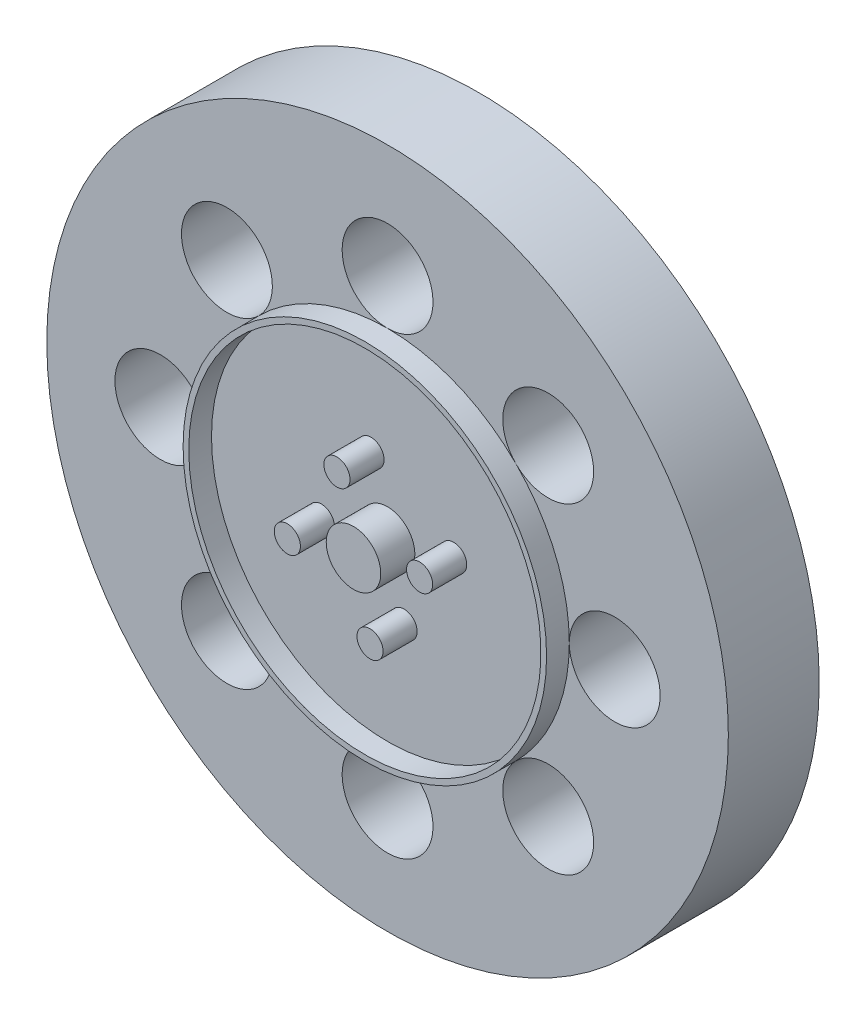
ISO-10303-21;
HEADER;
FILE_DESCRIPTION(('STEP AP214'),'2;1');
FILE_NAME('part.step','',(''),(''),'','','');
FILE_SCHEMA(('AUTOMOTIVE_DESIGN { 1 0 10303 214 1 1 1 1 }'));
ENDSEC;
DATA;
#1=APPLICATION_CONTEXT('core data for automotive mechanical design processes');
#2=APPLICATION_PROTOCOL_DEFINITION('international standard','automotive_design',2000,#1);
#3=PRODUCT_CONTEXT('',#1,'mechanical');
#4=PRODUCT('Part','Part','',(#3));
#5=PRODUCT_RELATED_PRODUCT_CATEGORY('part','',(#4));
#6=PRODUCT_DEFINITION_FORMATION('','',#4);
#7=PRODUCT_DEFINITION_CONTEXT('part definition',#1,'design');
#8=PRODUCT_DEFINITION('design','',#6,#7);
#9=PRODUCT_DEFINITION_SHAPE('','',#8);
#10=(LENGTH_UNIT() NAMED_UNIT(*) SI_UNIT(.MILLI.,.METRE.));
#11=(NAMED_UNIT(*) PLANE_ANGLE_UNIT() SI_UNIT($,.RADIAN.));
#12=(NAMED_UNIT(*) SI_UNIT($,.STERADIAN.) SOLID_ANGLE_UNIT());
#13=UNCERTAINTY_MEASURE_WITH_UNIT(LENGTH_MEASURE(1.E-05),#10,'distance_accuracy_value','');
#14=(GEOMETRIC_REPRESENTATION_CONTEXT(3) GLOBAL_UNCERTAINTY_ASSIGNED_CONTEXT((#13)) GLOBAL_UNIT_ASSIGNED_CONTEXT((#10,
#11,#12)) REPRESENTATION_CONTEXT('',''));
#15=CARTESIAN_POINT('',(0.,0.,0.));
#16=DIRECTION('',(0.,0.,1.));
#17=DIRECTION('',(1.,0.,0.));
#18=AXIS2_PLACEMENT_3D('',#15,#16,#17);
#19=CARTESIAN_POINT('',(0.,0.,-18.));
#20=DIRECTION('',(0.,0.,1.));
#21=DIRECTION('',(1.,0.,0.));
#22=AXIS2_PLACEMENT_3D('',#19,#20,#21);
#23=CYLINDRICAL_SURFACE('',#22,30.);
#24=CARTESIAN_POINT('',(0.,0.,-18.));
#25=DIRECTION('',(0.,0.,-1.));
#26=DIRECTION('',(-1.,0.,0.));
#27=AXIS2_PLACEMENT_3D('',#24,#25,#26);
#28=CIRCLE('',#27,30.);
#29=CARTESIAN_POINT('',(-30.,0.,-18.));
#30=VERTEX_POINT('',#29);
#31=EDGE_CURVE('E243',#30,#30,#28,.T.);
#32=ORIENTED_EDGE('',*,*,#31,.F.);
#33=EDGE_LOOP('',(#32));
#34=FACE_BOUND('',#33,.T.);
#35=CARTESIAN_POINT('',(0.,0.,-9.99999999999999));
#36=DIRECTION('',(0.,0.,-1.));
#37=DIRECTION('',(-1.,0.,0.));
#38=AXIS2_PLACEMENT_3D('',#35,#36,#37);
#39=CIRCLE('',#38,30.);
#40=CARTESIAN_POINT('',(-30.,0.,-9.99999999999999));
#41=VERTEX_POINT('',#40);
#42=EDGE_CURVE('E240',#41,#41,#39,.T.);
#43=ORIENTED_EDGE('',*,*,#42,.T.);
#44=EDGE_LOOP('',(#43));
#45=FACE_BOUND('',#44,.T.);
#46=ADVANCED_FACE('F42',(#34,#45),#23,.T.);
#47=CARTESIAN_POINT('',(0.,0.,-18.));
#48=DIRECTION('',(0.,0.,-1.));
#49=DIRECTION('',(-1.,0.,0.));
#50=AXIS2_PLACEMENT_3D('',#47,#48,#49);
#51=PLANE('',#50);
#52=DIRECTION('',(1.,0.,0.));
#53=VECTOR('',#52,1.);
#54=CARTESIAN_POINT('',(15.5,0.299999999999997,-18.));
#55=LINE('',#54,#53);
#56=CARTESIAN_POINT('',(14.5,0.299999999999997,-18.));
#57=VERTEX_POINT('',#56);
#58=CARTESIAN_POINT('',(15.5,0.299999999999997,-18.));
#59=VERTEX_POINT('',#58);
#60=EDGE_CURVE('E57',#57,#59,#55,.T.);
#61=ORIENTED_EDGE('',*,*,#60,.F.);
#62=DIRECTION('',(0.,1.,0.));
#63=VECTOR('',#62,1.);
#64=CARTESIAN_POINT('',(14.5,0.299999999999997,-18.));
#65=LINE('',#64,#63);
#66=CARTESIAN_POINT('',(14.5,-0.300000000000003,-18.));
#67=VERTEX_POINT('',#66);
#68=EDGE_CURVE('E126',#67,#57,#65,.T.);
#69=ORIENTED_EDGE('',*,*,#68,.F.);
#70=DIRECTION('',(-1.,0.,0.));
#71=VECTOR('',#70,1.);
#72=CARTESIAN_POINT('',(15.5,-0.300000000000003,-18.));
#73=LINE('',#72,#71);
#74=CARTESIAN_POINT('',(15.5,-0.300000000000003,-18.));
#75=VERTEX_POINT('',#74);
#76=EDGE_CURVE('E129',#75,#67,#73,.T.);
#77=ORIENTED_EDGE('',*,*,#76,.F.);
#78=DIRECTION('',(0.,-1.,0.));
#79=VECTOR('',#78,1.);
#80=CARTESIAN_POINT('',(15.5,-0.300000000000003,-18.));
#81=LINE('',#80,#79);
#82=EDGE_CURVE('E135',#59,#75,#81,.T.);
#83=ORIENTED_EDGE('',*,*,#82,.F.);
#84=EDGE_LOOP('',(#61,#69,#77,#83));
#85=FACE_BOUND('',#84,.T.);
#86=CARTESIAN_POINT('',(-12.,0.,-18.));
#87=DIRECTION('',(0.,0.,-1.));
#88=DIRECTION('',(-1.,0.,0.));
#89=AXIS2_PLACEMENT_3D('',#86,#87,#88);
#90=CIRCLE('',#89,1.);
#91=CARTESIAN_POINT('',(-13.,0.,-18.));
#92=VERTEX_POINT('',#91);
#93=EDGE_CURVE('E149',#92,#92,#90,.T.);
#94=ORIENTED_EDGE('',*,*,#93,.F.);
#95=EDGE_LOOP('',(#94));
#96=FACE_BOUND('',#95,.T.);
#97=CARTESIAN_POINT('',(0.,12.,-18.));
#98=DIRECTION('',(0.,0.,-1.));
#99=DIRECTION('',(-1.,0.,0.));
#100=AXIS2_PLACEMENT_3D('',#97,#98,#99);
#101=CIRCLE('',#100,1.);
#102=CARTESIAN_POINT('',(-1.,12.,-18.));
#103=VERTEX_POINT('',#102);
#104=EDGE_CURVE('E155',#103,#103,#101,.T.);
#105=ORIENTED_EDGE('',*,*,#104,.F.);
#106=EDGE_LOOP('',(#105));
#107=FACE_BOUND('',#106,.T.);
#108=CARTESIAN_POINT('',(12.,0.,-18.));
#109=DIRECTION('',(0.,0.,-1.));
#110=DIRECTION('',(-1.,0.,0.));
#111=AXIS2_PLACEMENT_3D('',#108,#109,#110);
#112=CIRCLE('',#111,0.999999999999998);
#113=CARTESIAN_POINT('',(11.,0.,-18.));
#114=VERTEX_POINT('',#113);
#115=EDGE_CURVE('E161',#114,#114,#112,.T.);
#116=ORIENTED_EDGE('',*,*,#115,.F.);
#117=EDGE_LOOP('',(#116));
#118=FACE_BOUND('',#117,.T.);
#119=CARTESIAN_POINT('',(0.,-12.,-18.));
#120=DIRECTION('',(0.,0.,-1.));
#121=DIRECTION('',(-1.,0.,0.));
#122=AXIS2_PLACEMENT_3D('',#119,#120,#121);
#123=CIRCLE('',#122,0.999999999999998);
#124=CARTESIAN_POINT('',(-0.999999999999996,-12.,-18.));
#125=VERTEX_POINT('',#124);
#126=EDGE_CURVE('E141',#125,#125,#123,.T.);
#127=ORIENTED_EDGE('',*,*,#126,.F.);
#128=EDGE_LOOP('',(#127));
#129=FACE_BOUND('',#128,.T.);
#130=CARTESIAN_POINT('',(-14.142135623731,-14.1421356237309,-18.));
#131=DIRECTION('',(0.,0.,-1.));
#132=DIRECTION('',(-1.,0.,0.));
#133=AXIS2_PLACEMENT_3D('',#130,#131,#132);
#134=CIRCLE('',#133,4.);
#135=CARTESIAN_POINT('',(-18.142135623731,-14.1421356237309,-18.));
#136=VERTEX_POINT('',#135);
#137=EDGE_CURVE('E148',#136,#136,#134,.T.);
#138=ORIENTED_EDGE('',*,*,#137,.F.);
#139=EDGE_LOOP('',(#138));
#140=FACE_BOUND('',#139,.T.);
#141=CARTESIAN_POINT('',(-20.,0.,-18.));
#142=DIRECTION('',(0.,0.,-1.));
#143=DIRECTION('',(-1.,0.,0.));
#144=AXIS2_PLACEMENT_3D('',#141,#142,#143);
#145=CIRCLE('',#144,4.);
#146=CARTESIAN_POINT('',(-24.,0.,-18.));
#147=VERTEX_POINT('',#146);
#148=EDGE_CURVE('E196',#147,#147,#145,.T.);
#149=ORIENTED_EDGE('',*,*,#148,.F.);
#150=EDGE_LOOP('',(#149));
#151=FACE_BOUND('',#150,.T.);
#152=CARTESIAN_POINT('',(-14.1421356237309,14.142135623731,-18.));
#153=DIRECTION('',(0.,0.,-1.));
#154=DIRECTION('',(-1.,0.,0.));
#155=AXIS2_PLACEMENT_3D('',#152,#153,#154);
#156=CIRCLE('',#155,4.);
#157=CARTESIAN_POINT('',(-18.1421356237309,14.142135623731,-18.));
#158=VERTEX_POINT('',#157);
#159=EDGE_CURVE('E191',#158,#158,#156,.T.);
#160=ORIENTED_EDGE('',*,*,#159,.F.);
#161=EDGE_LOOP('',(#160));
#162=FACE_BOUND('',#161,.T.);
#163=CARTESIAN_POINT('',(0.,20.,-18.));
#164=DIRECTION('',(0.,0.,-1.));
#165=DIRECTION('',(-1.,0.,0.));
#166=AXIS2_PLACEMENT_3D('',#163,#164,#165);
#167=CIRCLE('',#166,4.);
#168=CARTESIAN_POINT('',(-3.99999999999999,20.,-18.));
#169=VERTEX_POINT('',#168);
#170=EDGE_CURVE('E186',#169,#169,#167,.T.);
#171=ORIENTED_EDGE('',*,*,#170,.F.);
#172=EDGE_LOOP('',(#171));
#173=FACE_BOUND('',#172,.T.);
#174=CARTESIAN_POINT('',(14.142135623731,14.1421356237309,-18.));
#175=DIRECTION('',(0.,0.,-1.));
#176=DIRECTION('',(-1.,0.,0.));
#177=AXIS2_PLACEMENT_3D('',#174,#175,#176);
#178=CIRCLE('',#177,4.);
#179=CARTESIAN_POINT('',(10.142135623731,14.1421356237309,-18.));
#180=VERTEX_POINT('',#179);
#181=EDGE_CURVE('E181',#180,#180,#178,.T.);
#182=ORIENTED_EDGE('',*,*,#181,.F.);
#183=EDGE_LOOP('',(#182));
#184=FACE_BOUND('',#183,.T.);
#185=CARTESIAN_POINT('',(20.,0.,-18.));
#186=DIRECTION('',(0.,0.,-1.));
#187=DIRECTION('',(-1.,0.,0.));
#188=AXIS2_PLACEMENT_3D('',#185,#186,#187);
#189=CIRCLE('',#188,4.);
#190=CARTESIAN_POINT('',(16.,0.,-18.));
#191=VERTEX_POINT('',#190);
#192=EDGE_CURVE('E176',#191,#191,#189,.T.);
#193=ORIENTED_EDGE('',*,*,#192,.F.);
#194=EDGE_LOOP('',(#193));
#195=FACE_BOUND('',#194,.T.);
#196=CARTESIAN_POINT('',(14.1421356237309,-14.142135623731,-18.));
#197=DIRECTION('',(0.,0.,-1.));
#198=DIRECTION('',(-1.,0.,0.));
#199=AXIS2_PLACEMENT_3D('',#196,#197,#198);
#200=CIRCLE('',#199,4.);
#201=CARTESIAN_POINT('',(10.1421356237309,-14.142135623731,-18.));
#202=VERTEX_POINT('',#201);
#203=EDGE_CURVE('E169',#202,#202,#200,.T.);
#204=ORIENTED_EDGE('',*,*,#203,.F.);
#205=EDGE_LOOP('',(#204));
#206=FACE_BOUND('',#205,.T.);
#207=CARTESIAN_POINT('',(0.,-20.,-18.));
#208=DIRECTION('',(0.,0.,-1.));
#209=DIRECTION('',(-1.,0.,0.));
#210=AXIS2_PLACEMENT_3D('',#207,#208,#209);
#211=CIRCLE('',#210,4.);
#212=CARTESIAN_POINT('',(-4.00000000000001,-20.,-18.));
#213=VERTEX_POINT('',#212);
#214=EDGE_CURVE('E175',#213,#213,#211,.T.);
#215=ORIENTED_EDGE('',*,*,#214,.F.);
#216=EDGE_LOOP('',(#215));
#217=FACE_BOUND('',#216,.T.);
#218=ORIENTED_EDGE('',*,*,#31,.T.);
#219=EDGE_LOOP('',(#218));
#220=FACE_BOUND('',#219,.T.);
#221=ADVANCED_FACE('F270',(#85,#96,#107,#118,#129,#140,#151,#162,#173,#184,#195,#206,#217,#220),
#51,.T.);
#222=CARTESIAN_POINT('',(0.,0.,-9.99999999999999));
#223=DIRECTION('',(0.,0.,-1.));
#224=DIRECTION('',(-1.,0.,0.));
#225=AXIS2_PLACEMENT_3D('',#222,#223,#224);
#226=PLANE('',#225);
#227=CARTESIAN_POINT('',(0.,0.,-9.99999999999999));
#228=DIRECTION('',(0.,0.,-1.));
#229=DIRECTION('',(-1.,0.,0.));
#230=AXIS2_PLACEMENT_3D('',#227,#228,#229);
#231=CIRCLE('',#230,16.);
#232=CARTESIAN_POINT('',(0.,-16.,-9.99999999999999));
#233=VERTEX_POINT('',#232);
#234=CARTESIAN_POINT('',(-11.3137084989848,-11.3137084989848,-9.99999999999999));
#235=VERTEX_POINT('',#234);
#236=EDGE_CURVE('E589',#233,#235,#231,.T.);
#237=ORIENTED_EDGE('',*,*,#236,.T.);
#238=CARTESIAN_POINT('',(-14.142135623731,-14.1421356237309,-9.99999999999999));
#239=DIRECTION('',(0.,0.,-1.));
#240=DIRECTION('',(-1.,0.,0.));
#241=AXIS2_PLACEMENT_3D('',#238,#239,#240);
#242=CIRCLE('',#241,4.);
#243=EDGE_CURVE('E63',#235,#235,#242,.F.);
#244=ORIENTED_EDGE('',*,*,#243,.F.);
#245=CARTESIAN_POINT('',(-16.,0.,-9.99999999999999));
#246=VERTEX_POINT('',#245);
#247=EDGE_CURVE('E210',#235,#246,#231,.T.);
#248=ORIENTED_EDGE('',*,*,#247,.T.);
#249=CARTESIAN_POINT('',(-20.,0.,-9.99999999999999));
#250=DIRECTION('',(0.,0.,-1.));
#251=DIRECTION('',(-1.,0.,0.));
#252=AXIS2_PLACEMENT_3D('',#249,#250,#251);
#253=CIRCLE('',#252,4.);
#254=EDGE_CURVE('E194',#246,#246,#253,.F.);
#255=ORIENTED_EDGE('',*,*,#254,.F.);
#256=CARTESIAN_POINT('',(-11.3137084989848,11.3137084989848,-9.99999999999999));
#257=VERTEX_POINT('',#256);
#258=EDGE_CURVE('E215',#246,#257,#231,.T.);
#259=ORIENTED_EDGE('',*,*,#258,.T.);
#260=CARTESIAN_POINT('',(-14.1421356237309,14.142135623731,-9.99999999999999));
#261=DIRECTION('',(0.,0.,-1.));
#262=DIRECTION('',(-1.,0.,0.));
#263=AXIS2_PLACEMENT_3D('',#260,#261,#262);
#264=CIRCLE('',#263,4.);
#265=EDGE_CURVE('E189',#257,#257,#264,.F.);
#266=ORIENTED_EDGE('',*,*,#265,.F.);
#267=CARTESIAN_POINT('',(0.,16.,-9.99999999999999));
#268=VERTEX_POINT('',#267);
#269=EDGE_CURVE('E218',#257,#268,#231,.T.);
#270=ORIENTED_EDGE('',*,*,#269,.T.);
#271=CARTESIAN_POINT('',(0.,20.,-9.99999999999999));
#272=DIRECTION('',(0.,0.,-1.));
#273=DIRECTION('',(-1.,0.,0.));
#274=AXIS2_PLACEMENT_3D('',#271,#272,#273);
#275=CIRCLE('',#274,4.);
#276=EDGE_CURVE('E184',#268,#268,#275,.F.);
#277=ORIENTED_EDGE('',*,*,#276,.F.);
#278=CARTESIAN_POINT('',(11.3137084989848,11.3137084989848,-9.99999999999999));
#279=VERTEX_POINT('',#278);
#280=EDGE_CURVE('E607',#268,#279,#231,.T.);
#281=ORIENTED_EDGE('',*,*,#280,.T.);
#282=CARTESIAN_POINT('',(14.142135623731,14.1421356237309,-9.99999999999999));
#283=DIRECTION('',(0.,0.,-1.));
#284=DIRECTION('',(-1.,0.,0.));
#285=AXIS2_PLACEMENT_3D('',#282,#283,#284);
#286=CIRCLE('',#285,4.);
#287=EDGE_CURVE('E179',#279,#279,#286,.F.);
#288=ORIENTED_EDGE('',*,*,#287,.F.);
#289=CARTESIAN_POINT('',(16.,0.,-9.99999999999999));
#290=VERTEX_POINT('',#289);
#291=EDGE_CURVE('E608',#279,#290,#231,.T.);
#292=ORIENTED_EDGE('',*,*,#291,.T.);
#293=CARTESIAN_POINT('',(20.,0.,-9.99999999999999));
#294=DIRECTION('',(0.,0.,-1.));
#295=DIRECTION('',(-1.,0.,0.));
#296=AXIS2_PLACEMENT_3D('',#293,#294,#295);
#297=CIRCLE('',#296,4.);
#298=EDGE_CURVE('E173',#290,#290,#297,.F.);
#299=ORIENTED_EDGE('',*,*,#298,.F.);
#300=CARTESIAN_POINT('',(11.3137084989848,-11.3137084989848,-9.99999999999999));
#301=VERTEX_POINT('',#300);
#302=EDGE_CURVE('E597',#290,#301,#231,.T.);
#303=ORIENTED_EDGE('',*,*,#302,.T.);
#304=CARTESIAN_POINT('',(14.1421356237309,-14.142135623731,-9.99999999999999));
#305=DIRECTION('',(0.,0.,-1.));
#306=DIRECTION('',(-1.,0.,0.));
#307=AXIS2_PLACEMENT_3D('',#304,#305,#306);
#308=CIRCLE('',#307,4.);
#309=EDGE_CURVE('E172',#301,#301,#308,.F.);
#310=ORIENTED_EDGE('',*,*,#309,.F.);
#311=EDGE_CURVE('E596',#301,#233,#231,.T.);
#312=ORIENTED_EDGE('',*,*,#311,.T.);
#313=CARTESIAN_POINT('',(0.,-20.,-9.99999999999999));
#314=DIRECTION('',(0.,0.,-1.));
#315=DIRECTION('',(-1.,0.,0.));
#316=AXIS2_PLACEMENT_3D('',#313,#314,#315);
#317=CIRCLE('',#316,4.);
#318=EDGE_CURVE('E205',#233,#233,#317,.F.);
#319=ORIENTED_EDGE('',*,*,#318,.F.);
#320=EDGE_LOOP('',(#237,#244,#248,#255,#259,#266,#270,#277,#281,#288,#292,#299,#303,#310,#312,#319));
#321=FACE_BOUND('',#320,.T.);
#322=ORIENTED_EDGE('',*,*,#42,.F.);
#323=EDGE_LOOP('',(#322));
#324=FACE_BOUND('',#323,.T.);
#325=ADVANCED_FACE('F265',(#321,#324),#226,.F.);
#326=CARTESIAN_POINT('',(0.,0.,-7.99999999999999));
#327=DIRECTION('',(0.,0.,-1.));
#328=DIRECTION('',(-1.,0.,0.));
#329=AXIS2_PLACEMENT_3D('',#326,#327,#328);
#330=CYLINDRICAL_SURFACE('',#329,16.);
#331=CARTESIAN_POINT('',(0.,0.,-7.99999999999999));
#332=DIRECTION('',(0.,0.,-1.));
#333=DIRECTION('',(-1.,0.,0.));
#334=AXIS2_PLACEMENT_3D('',#331,#332,#333);
#335=CIRCLE('',#334,16.);
#336=CARTESIAN_POINT('',(-16.,0.,-7.99999999999999));
#337=VERTEX_POINT('',#336);
#338=EDGE_CURVE('E211',#337,#337,#335,.T.);
#339=ORIENTED_EDGE('',*,*,#338,.T.);
#340=EDGE_LOOP('',(#339));
#341=FACE_BOUND('',#340,.T.);
#342=ORIENTED_EDGE('',*,*,#258,.F.);
#343=ORIENTED_EDGE('',*,*,#247,.F.);
#344=ORIENTED_EDGE('',*,*,#236,.F.);
#345=ORIENTED_EDGE('',*,*,#311,.F.);
#346=ORIENTED_EDGE('',*,*,#302,.F.);
#347=ORIENTED_EDGE('',*,*,#291,.F.);
#348=ORIENTED_EDGE('',*,*,#280,.F.);
#349=ORIENTED_EDGE('',*,*,#269,.F.);
#350=EDGE_LOOP('',(#342,#343,#344,#345,#346,#347,#348,#349));
#351=FACE_BOUND('',#350,.T.);
#352=ADVANCED_FACE('F318',(#341,#351),#330,.T.);
#353=CARTESIAN_POINT('',(0.,0.,-7.99999999999999));
#354=DIRECTION('',(0.,0.,-1.));
#355=DIRECTION('',(-1.,0.,0.));
#356=AXIS2_PLACEMENT_3D('',#353,#354,#355);
#357=PLANE('',#356);
#358=CARTESIAN_POINT('',(0.,0.,-7.99999999999999));
#359=DIRECTION('',(0.,0.,-1.));
#360=DIRECTION('',(-1.,0.,0.));
#361=AXIS2_PLACEMENT_3D('',#358,#359,#360);
#362=CIRCLE('',#361,15.5);
#363=CARTESIAN_POINT('',(-15.5,0.,-7.99999999999999));
#364=VERTEX_POINT('',#363);
#365=EDGE_CURVE('E207',#364,#364,#362,.T.);
#366=ORIENTED_EDGE('',*,*,#365,.T.);
#367=EDGE_LOOP('',(#366));
#368=FACE_BOUND('',#367,.T.);
#369=ORIENTED_EDGE('',*,*,#338,.F.);
#370=EDGE_LOOP('',(#369));
#371=FACE_BOUND('',#370,.T.);
#372=ADVANCED_FACE('F321',(#368,#371),#357,.F.);
#373=CARTESIAN_POINT('',(0.,0.,-7.99999999999999));
#374=DIRECTION('',(0.,0.,-1.));
#375=DIRECTION('',(-1.,0.,0.));
#376=AXIS2_PLACEMENT_3D('',#373,#374,#375);
#377=CYLINDRICAL_SURFACE('',#376,15.5);
#378=ORIENTED_EDGE('',*,*,#365,.F.);
#379=EDGE_LOOP('',(#378));
#380=FACE_BOUND('',#379,.T.);
#381=CARTESIAN_POINT('',(0.,0.,-9.99999999999999));
#382=DIRECTION('',(0.,0.,-1.));
#383=DIRECTION('',(-1.,0.,0.));
#384=AXIS2_PLACEMENT_3D('',#381,#382,#383);
#385=CIRCLE('',#384,15.5);
#386=CARTESIAN_POINT('',(-15.5,0.,-9.99999999999999));
#387=VERTEX_POINT('',#386);
#388=EDGE_CURVE('E12',#387,#387,#385,.T.);
#389=ORIENTED_EDGE('',*,*,#388,.T.);
#390=EDGE_LOOP('',(#389));
#391=FACE_BOUND('',#390,.T.);
#392=ADVANCED_FACE('F316',(#380,#391),#377,.F.);
#393=CARTESIAN_POINT('',(0.,0.,-6.99999999999999));
#394=DIRECTION('',(0.,0.,-1.));
#395=DIRECTION('',(-1.,0.,0.));
#396=AXIS2_PLACEMENT_3D('',#393,#394,#395);
#397=PLANE('',#396);
#398=CARTESIAN_POINT('',(-1.45496285654164,5.82091771854611,-6.99999999999999));
#399=DIRECTION('',(0.,0.,-1.));
#400=DIRECTION('',(-1.,0.,0.));
#401=AXIS2_PLACEMENT_3D('',#398,#399,#400);
#402=CIRCLE('',#401,1.15);
#403=CARTESIAN_POINT('',(-2.60496285654164,5.82091771854611,-6.99999999999999));
#404=VERTEX_POINT('',#403);
#405=EDGE_CURVE('E219',#404,#404,#402,.T.);
#406=ORIENTED_EDGE('',*,*,#405,.F.);
#407=EDGE_LOOP('',(#406));
#408=FACE_BOUND('',#407,.T.);
#409=ADVANCED_FACE('F311',(#408),#397,.F.);
#410=CARTESIAN_POINT('',(0.,0.,-6.99999999999999));
#411=DIRECTION('',(0.,0.,-1.));
#412=DIRECTION('',(-1.,0.,0.));
#413=AXIS2_PLACEMENT_3D('',#410,#411,#412);
#414=PLANE('',#413);
#415=CARTESIAN_POINT('',(5.82091771854612,1.45496285654163,-6.99999999999999));
#416=DIRECTION('',(0.,0.,-1.));
#417=DIRECTION('',(-1.,0.,0.));
#418=AXIS2_PLACEMENT_3D('',#415,#416,#417);
#419=CIRCLE('',#418,1.15);
#420=CARTESIAN_POINT('',(4.67091771854612,1.45496285654163,-6.99999999999999));
#421=VERTEX_POINT('',#420);
#422=EDGE_CURVE('E225',#421,#421,#419,.T.);
#423=ORIENTED_EDGE('',*,*,#422,.F.);
#424=EDGE_LOOP('',(#423));
#425=FACE_BOUND('',#424,.T.);
#426=ADVANCED_FACE('F299',(#425),#414,.F.);
#427=CARTESIAN_POINT('',(0.,0.,-6.99999999999999));
#428=DIRECTION('',(0.,0.,-1.));
#429=DIRECTION('',(-1.,0.,0.));
#430=AXIS2_PLACEMENT_3D('',#427,#428,#429);
#431=PLANE('',#430);
#432=CARTESIAN_POINT('',(1.45496285654165,-5.82091771854613,-6.99999999999999));
#433=DIRECTION('',(0.,0.,-1.));
#434=DIRECTION('',(-1.,0.,0.));
#435=AXIS2_PLACEMENT_3D('',#432,#433,#434);
#436=CIRCLE('',#435,1.15);
#437=CARTESIAN_POINT('',(0.304962856541646,-5.82091771854613,-6.99999999999999));
#438=VERTEX_POINT('',#437);
#439=EDGE_CURVE('E231',#438,#438,#436,.T.);
#440=ORIENTED_EDGE('',*,*,#439,.F.);
#441=EDGE_LOOP('',(#440));
#442=FACE_BOUND('',#441,.T.);
#443=ADVANCED_FACE('F292',(#442),#431,.F.);
#444=CARTESIAN_POINT('',(0.,0.,-6.99999999999999));
#445=DIRECTION('',(0.,0.,-1.));
#446=DIRECTION('',(-1.,0.,0.));
#447=AXIS2_PLACEMENT_3D('',#444,#445,#446);
#448=PLANE('',#447);
#449=CARTESIAN_POINT('',(-5.82091771854612,-1.45496285654166,-6.99999999999999));
#450=DIRECTION('',(0.,0.,-1.));
#451=DIRECTION('',(-1.,0.,0.));
#452=AXIS2_PLACEMENT_3D('',#449,#450,#451);
#453=CIRCLE('',#452,1.15);
#454=CARTESIAN_POINT('',(-6.97091771854612,-1.45496285654166,-6.99999999999999));
#455=VERTEX_POINT('',#454);
#456=EDGE_CURVE('E237',#455,#455,#453,.T.);
#457=ORIENTED_EDGE('',*,*,#456,.F.);
#458=EDGE_LOOP('',(#457));
#459=FACE_BOUND('',#458,.T.);
#460=ADVANCED_FACE('F283',(#459),#448,.F.);
#461=CARTESIAN_POINT('',(0.,0.,-6.99999999999999));
#462=DIRECTION('',(0.,0.,-1.));
#463=DIRECTION('',(-1.,0.,0.));
#464=AXIS2_PLACEMENT_3D('',#461,#462,#463);
#465=PLANE('',#464);
#466=CARTESIAN_POINT('',(0.,0.,-6.99999999999999));
#467=DIRECTION('',(0.,0.,-1.));
#468=DIRECTION('',(-1.,0.,0.));
#469=AXIS2_PLACEMENT_3D('',#466,#467,#468);
#470=CIRCLE('',#469,2.4);
#471=CARTESIAN_POINT('',(-2.4,0.,-6.99999999999999));
#472=VERTEX_POINT('',#471);
#473=EDGE_CURVE('E50',#472,#472,#470,.T.);
#474=ORIENTED_EDGE('',*,*,#473,.F.);
#475=EDGE_LOOP('',(#474));
#476=FACE_BOUND('',#475,.T.);
#477=ADVANCED_FACE('F280',(#476),#465,.F.);
#478=CARTESIAN_POINT('',(-1.45496285654164,5.82091771854611,-6.99999999999999));
#479=DIRECTION('',(0.,0.,-1.));
#480=DIRECTION('',(-1.,0.,0.));
#481=AXIS2_PLACEMENT_3D('',#478,#479,#480);
#482=CYLINDRICAL_SURFACE('',#481,1.15);
#483=ORIENTED_EDGE('',*,*,#405,.T.);
#484=EDGE_LOOP('',(#483));
#485=FACE_BOUND('',#484,.T.);
#486=CARTESIAN_POINT('',(-1.45496285654164,5.82091771854611,-9.99999999999999));
#487=DIRECTION('',(0.,0.,-1.));
#488=DIRECTION('',(-1.,0.,0.));
#489=AXIS2_PLACEMENT_3D('',#486,#487,#488);
#490=CIRCLE('',#489,1.15);
#491=CARTESIAN_POINT('',(-2.60496285654164,5.82091771854611,-9.99999999999999));
#492=VERTEX_POINT('',#491);
#493=EDGE_CURVE('E214',#492,#492,#490,.T.);
#494=ORIENTED_EDGE('',*,*,#493,.F.);
#495=EDGE_LOOP('',(#494));
#496=FACE_BOUND('',#495,.T.);
#497=ADVANCED_FACE('F282',(#485,#496),#482,.T.);
#498=CARTESIAN_POINT('',(5.82091771854612,1.45496285654163,-6.99999999999999));
#499=DIRECTION('',(0.,0.,-1.));
#500=DIRECTION('',(-1.,0.,0.));
#501=AXIS2_PLACEMENT_3D('',#498,#499,#500);
#502=CYLINDRICAL_SURFACE('',#501,1.15);
#503=ORIENTED_EDGE('',*,*,#422,.T.);
#504=EDGE_LOOP('',(#503));
#505=FACE_BOUND('',#504,.T.);
#506=CARTESIAN_POINT('',(5.82091771854612,1.45496285654163,-9.99999999999999));
#507=DIRECTION('',(0.,0.,-1.));
#508=DIRECTION('',(-1.,0.,0.));
#509=AXIS2_PLACEMENT_3D('',#506,#507,#508);
#510=CIRCLE('',#509,1.15);
#511=CARTESIAN_POINT('',(4.67091771854612,1.45496285654163,-9.99999999999999));
#512=VERTEX_POINT('',#511);
#513=EDGE_CURVE('E222',#512,#512,#510,.T.);
#514=ORIENTED_EDGE('',*,*,#513,.F.);
#515=EDGE_LOOP('',(#514));
#516=FACE_BOUND('',#515,.T.);
#517=ADVANCED_FACE('F289',(#505,#516),#502,.T.);
#518=CARTESIAN_POINT('',(1.45496285654165,-5.82091771854613,-6.99999999999999));
#519=DIRECTION('',(0.,0.,-1.));
#520=DIRECTION('',(-1.,0.,0.));
#521=AXIS2_PLACEMENT_3D('',#518,#519,#520);
#522=CYLINDRICAL_SURFACE('',#521,1.15);
#523=ORIENTED_EDGE('',*,*,#439,.T.);
#524=EDGE_LOOP('',(#523));
#525=FACE_BOUND('',#524,.T.);
#526=CARTESIAN_POINT('',(1.45496285654165,-5.82091771854613,-9.99999999999999));
#527=DIRECTION('',(0.,0.,-1.));
#528=DIRECTION('',(-1.,0.,0.));
#529=AXIS2_PLACEMENT_3D('',#526,#527,#528);
#530=CIRCLE('',#529,1.15);
#531=CARTESIAN_POINT('',(0.304962856541646,-5.82091771854613,-9.99999999999999));
#532=VERTEX_POINT('',#531);
#533=EDGE_CURVE('E228',#532,#532,#530,.T.);
#534=ORIENTED_EDGE('',*,*,#533,.F.);
#535=EDGE_LOOP('',(#534));
#536=FACE_BOUND('',#535,.T.);
#537=ADVANCED_FACE('F266',(#525,#536),#522,.T.);
#538=CARTESIAN_POINT('',(-5.82091771854612,-1.45496285654166,-6.99999999999999));
#539=DIRECTION('',(0.,0.,-1.));
#540=DIRECTION('',(-1.,0.,0.));
#541=AXIS2_PLACEMENT_3D('',#538,#539,#540);
#542=CYLINDRICAL_SURFACE('',#541,1.15);
#543=ORIENTED_EDGE('',*,*,#456,.T.);
#544=EDGE_LOOP('',(#543));
#545=FACE_BOUND('',#544,.T.);
#546=CARTESIAN_POINT('',(-5.82091771854612,-1.45496285654166,-9.99999999999999));
#547=DIRECTION('',(0.,0.,-1.));
#548=DIRECTION('',(-1.,0.,0.));
#549=AXIS2_PLACEMENT_3D('',#546,#547,#548);
#550=CIRCLE('',#549,1.15);
#551=CARTESIAN_POINT('',(-6.97091771854612,-1.45496285654166,-9.99999999999999));
#552=VERTEX_POINT('',#551);
#553=EDGE_CURVE('E234',#552,#552,#550,.T.);
#554=ORIENTED_EDGE('',*,*,#553,.F.);
#555=EDGE_LOOP('',(#554));
#556=FACE_BOUND('',#555,.T.);
#557=ADVANCED_FACE('F257',(#545,#556),#542,.T.);
#558=CARTESIAN_POINT('',(0.,0.,-6.99999999999999));
#559=DIRECTION('',(0.,0.,-1.));
#560=DIRECTION('',(-1.,0.,0.));
#561=AXIS2_PLACEMENT_3D('',#558,#559,#560);
#562=CYLINDRICAL_SURFACE('',#561,2.4);
#563=ORIENTED_EDGE('',*,*,#473,.T.);
#564=EDGE_LOOP('',(#563));
#565=FACE_BOUND('',#564,.T.);
#566=CARTESIAN_POINT('',(0.,0.,-9.99999999999999));
#567=DIRECTION('',(0.,0.,-1.));
#568=DIRECTION('',(-1.,0.,0.));
#569=AXIS2_PLACEMENT_3D('',#566,#567,#568);
#570=CIRCLE('',#569,2.4);
#571=CARTESIAN_POINT('',(-2.4,0.,-9.99999999999999));
#572=VERTEX_POINT('',#571);
#573=EDGE_CURVE('E246',#572,#572,#570,.T.);
#574=ORIENTED_EDGE('',*,*,#573,.F.);
#575=EDGE_LOOP('',(#574));
#576=FACE_BOUND('',#575,.T.);
#577=ADVANCED_FACE('F44',(#565,#576),#562,.T.);
#578=ORIENTED_EDGE('',*,*,#573,.T.);
#579=EDGE_LOOP('',(#578));
#580=FACE_BOUND('',#579,.T.);
#581=ORIENTED_EDGE('',*,*,#553,.T.);
#582=EDGE_LOOP('',(#581));
#583=FACE_BOUND('',#582,.T.);
#584=ORIENTED_EDGE('',*,*,#533,.T.);
#585=EDGE_LOOP('',(#584));
#586=FACE_BOUND('',#585,.T.);
#587=ORIENTED_EDGE('',*,*,#513,.T.);
#588=EDGE_LOOP('',(#587));
#589=FACE_BOUND('',#588,.T.);
#590=ORIENTED_EDGE('',*,*,#493,.T.);
#591=EDGE_LOOP('',(#590));
#592=FACE_BOUND('',#591,.T.);
#593=ORIENTED_EDGE('',*,*,#388,.F.);
#594=EDGE_LOOP('',(#593));
#595=FACE_BOUND('',#594,.T.);
#596=ADVANCED_FACE('F253',(#580,#583,#586,#589,#592,#595),#226,.F.);
#597=CARTESIAN_POINT('',(0.,-20.,-6.999));
#598=DIRECTION('',(0.,0.,-1.));
#599=DIRECTION('',(-1.,0.,0.));
#600=AXIS2_PLACEMENT_3D('',#597,#598,#599);
#601=CYLINDRICAL_SURFACE('',#600,4.);
#602=ORIENTED_EDGE('',*,*,#214,.T.);
#603=EDGE_LOOP('',(#602));
#604=FACE_BOUND('',#603,.T.);
#605=ORIENTED_EDGE('',*,*,#318,.T.);
#606=EDGE_LOOP('',(#605));
#607=FACE_BOUND('',#606,.T.);
#608=ADVANCED_FACE('F263',(#604,#607),#601,.F.);
#609=CARTESIAN_POINT('',(14.1421356237309,-14.142135623731,-6.999));
#610=DIRECTION('',(0.,0.,-1.));
#611=DIRECTION('',(-1.,0.,0.));
#612=AXIS2_PLACEMENT_3D('',#609,#610,#611);
#613=CYLINDRICAL_SURFACE('',#612,4.);
#614=ORIENTED_EDGE('',*,*,#203,.T.);
#615=EDGE_LOOP('',(#614));
#616=FACE_BOUND('',#615,.T.);
#617=ORIENTED_EDGE('',*,*,#309,.T.);
#618=EDGE_LOOP('',(#617));
#619=FACE_BOUND('',#618,.T.);
#620=ADVANCED_FACE('F331',(#616,#619),#613,.F.);
#621=CARTESIAN_POINT('',(20.,0.,-6.999));
#622=DIRECTION('',(0.,0.,-1.));
#623=DIRECTION('',(-1.,0.,0.));
#624=AXIS2_PLACEMENT_3D('',#621,#622,#623);
#625=CYLINDRICAL_SURFACE('',#624,4.);
#626=ORIENTED_EDGE('',*,*,#192,.T.);
#627=EDGE_LOOP('',(#626));
#628=FACE_BOUND('',#627,.T.);
#629=ORIENTED_EDGE('',*,*,#298,.T.);
#630=EDGE_LOOP('',(#629));
#631=FACE_BOUND('',#630,.T.);
#632=ADVANCED_FACE('F353',(#628,#631),#625,.F.);
#633=CARTESIAN_POINT('',(14.142135623731,14.1421356237309,-6.999));
#634=DIRECTION('',(0.,0.,-1.));
#635=DIRECTION('',(-1.,0.,0.));
#636=AXIS2_PLACEMENT_3D('',#633,#634,#635);
#637=CYLINDRICAL_SURFACE('',#636,4.);
#638=ORIENTED_EDGE('',*,*,#181,.T.);
#639=EDGE_LOOP('',(#638));
#640=FACE_BOUND('',#639,.T.);
#641=ORIENTED_EDGE('',*,*,#287,.T.);
#642=EDGE_LOOP('',(#641));
#643=FACE_BOUND('',#642,.T.);
#644=ADVANCED_FACE('F349',(#640,#643),#637,.F.);
#645=CARTESIAN_POINT('',(0.,20.,-6.999));
#646=DIRECTION('',(0.,0.,-1.));
#647=DIRECTION('',(-1.,0.,0.));
#648=AXIS2_PLACEMENT_3D('',#645,#646,#647);
#649=CYLINDRICAL_SURFACE('',#648,4.);
#650=ORIENTED_EDGE('',*,*,#170,.T.);
#651=EDGE_LOOP('',(#650));
#652=FACE_BOUND('',#651,.T.);
#653=ORIENTED_EDGE('',*,*,#276,.T.);
#654=EDGE_LOOP('',(#653));
#655=FACE_BOUND('',#654,.T.);
#656=ADVANCED_FACE('F345',(#652,#655),#649,.F.);
#657=CARTESIAN_POINT('',(-14.1421356237309,14.142135623731,-6.999));
#658=DIRECTION('',(0.,0.,-1.));
#659=DIRECTION('',(-1.,0.,0.));
#660=AXIS2_PLACEMENT_3D('',#657,#658,#659);
#661=CYLINDRICAL_SURFACE('',#660,4.);
#662=ORIENTED_EDGE('',*,*,#159,.T.);
#663=EDGE_LOOP('',(#662));
#664=FACE_BOUND('',#663,.T.);
#665=ORIENTED_EDGE('',*,*,#265,.T.);
#666=EDGE_LOOP('',(#665));
#667=FACE_BOUND('',#666,.T.);
#668=ADVANCED_FACE('F341',(#664,#667),#661,.F.);
#669=CARTESIAN_POINT('',(-20.,0.,-6.999));
#670=DIRECTION('',(0.,0.,-1.));
#671=DIRECTION('',(-1.,0.,0.));
#672=AXIS2_PLACEMENT_3D('',#669,#670,#671);
#673=CYLINDRICAL_SURFACE('',#672,4.);
#674=ORIENTED_EDGE('',*,*,#148,.T.);
#675=EDGE_LOOP('',(#674));
#676=FACE_BOUND('',#675,.T.);
#677=ORIENTED_EDGE('',*,*,#254,.T.);
#678=EDGE_LOOP('',(#677));
#679=FACE_BOUND('',#678,.T.);
#680=ADVANCED_FACE('F337',(#676,#679),#673,.F.);
#681=CARTESIAN_POINT('',(-14.142135623731,-14.1421356237309,-6.999));
#682=DIRECTION('',(0.,0.,-1.));
#683=DIRECTION('',(-1.,0.,0.));
#684=AXIS2_PLACEMENT_3D('',#681,#682,#683);
#685=CYLINDRICAL_SURFACE('',#684,4.);
#686=ORIENTED_EDGE('',*,*,#137,.T.);
#687=EDGE_LOOP('',(#686));
#688=FACE_BOUND('',#687,.T.);
#689=ORIENTED_EDGE('',*,*,#243,.T.);
#690=EDGE_LOOP('',(#689));
#691=FACE_BOUND('',#690,.T.);
#692=ADVANCED_FACE('F333',(#688,#691),#685,.F.);
#693=CARTESIAN_POINT('',(0.,-12.,-14.));
#694=DIRECTION('',(0.,0.,-1.));
#695=DIRECTION('',(-1.,0.,0.));
#696=AXIS2_PLACEMENT_3D('',#693,#694,#695);
#697=CYLINDRICAL_SURFACE('',#696,0.999999999999998);
#698=CARTESIAN_POINT('',(0.,-12.,-14.));
#699=DIRECTION('',(0.,0.,-1.));
#700=DIRECTION('',(-1.,0.,0.));
#701=AXIS2_PLACEMENT_3D('',#698,#699,#700);
#702=CIRCLE('',#701,0.999999999999998);
#703=CARTESIAN_POINT('',(-0.999999999999996,-12.,-14.));
#704=VERTEX_POINT('',#703);
#705=EDGE_CURVE('E164',#704,#704,#702,.T.);
#706=ORIENTED_EDGE('',*,*,#705,.F.);
#707=EDGE_LOOP('',(#706));
#708=FACE_BOUND('',#707,.T.);
#709=ORIENTED_EDGE('',*,*,#126,.T.);
#710=EDGE_LOOP('',(#709));
#711=FACE_BOUND('',#710,.T.);
#712=ADVANCED_FACE('F336',(#708,#711),#697,.F.);
#713=CARTESIAN_POINT('',(0.,-12.,-14.));
#714=DIRECTION('',(0.,0.,-1.));
#715=DIRECTION('',(-1.,0.,0.));
#716=AXIS2_PLACEMENT_3D('',#713,#714,#715);
#717=PLANE('',#716);
#718=ORIENTED_EDGE('',*,*,#705,.T.);
#719=EDGE_LOOP('',(#718));
#720=FACE_BOUND('',#719,.T.);
#721=ADVANCED_FACE('F363',(#720),#717,.T.);
#722=CARTESIAN_POINT('',(12.,0.,-14.));
#723=DIRECTION('',(0.,0.,-1.));
#724=DIRECTION('',(-1.,0.,0.));
#725=AXIS2_PLACEMENT_3D('',#722,#723,#724);
#726=CYLINDRICAL_SURFACE('',#725,0.999999999999998);
#727=CARTESIAN_POINT('',(12.,0.,-14.));
#728=DIRECTION('',(0.,0.,-1.));
#729=DIRECTION('',(-1.,0.,0.));
#730=AXIS2_PLACEMENT_3D('',#727,#728,#729);
#731=CIRCLE('',#730,0.999999999999998);
#732=CARTESIAN_POINT('',(11.,0.,-14.));
#733=VERTEX_POINT('',#732);
#734=EDGE_CURVE('E158',#733,#733,#731,.T.);
#735=ORIENTED_EDGE('',*,*,#734,.F.);
#736=EDGE_LOOP('',(#735));
#737=FACE_BOUND('',#736,.T.);
#738=ORIENTED_EDGE('',*,*,#115,.T.);
#739=EDGE_LOOP('',(#738));
#740=FACE_BOUND('',#739,.T.);
#741=ADVANCED_FACE('F367',(#737,#740),#726,.F.);
#742=CARTESIAN_POINT('',(12.,0.,-14.));
#743=DIRECTION('',(0.,0.,-1.));
#744=DIRECTION('',(-1.,0.,0.));
#745=AXIS2_PLACEMENT_3D('',#742,#743,#744);
#746=PLANE('',#745);
#747=ORIENTED_EDGE('',*,*,#734,.T.);
#748=EDGE_LOOP('',(#747));
#749=FACE_BOUND('',#748,.T.);
#750=ADVANCED_FACE('F371',(#749),#746,.T.);
#751=CARTESIAN_POINT('',(0.,12.,-14.));
#752=DIRECTION('',(0.,0.,-1.));
#753=DIRECTION('',(-1.,0.,0.));
#754=AXIS2_PLACEMENT_3D('',#751,#752,#753);
#755=CYLINDRICAL_SURFACE('',#754,1.);
#756=CARTESIAN_POINT('',(0.,12.,-14.));
#757=DIRECTION('',(0.,0.,-1.));
#758=DIRECTION('',(-1.,0.,0.));
#759=AXIS2_PLACEMENT_3D('',#756,#757,#758);
#760=CIRCLE('',#759,1.);
#761=CARTESIAN_POINT('',(-1.,12.,-14.));
#762=VERTEX_POINT('',#761);
#763=EDGE_CURVE('E152',#762,#762,#760,.T.);
#764=ORIENTED_EDGE('',*,*,#763,.F.);
#765=EDGE_LOOP('',(#764));
#766=FACE_BOUND('',#765,.T.);
#767=ORIENTED_EDGE('',*,*,#104,.T.);
#768=EDGE_LOOP('',(#767));
#769=FACE_BOUND('',#768,.T.);
#770=ADVANCED_FACE('F375',(#766,#769),#755,.F.);
#771=CARTESIAN_POINT('',(0.,12.,-14.));
#772=DIRECTION('',(0.,0.,-1.));
#773=DIRECTION('',(-1.,0.,0.));
#774=AXIS2_PLACEMENT_3D('',#771,#772,#773);
#775=PLANE('',#774);
#776=ORIENTED_EDGE('',*,*,#763,.T.);
#777=EDGE_LOOP('',(#776));
#778=FACE_BOUND('',#777,.T.);
#779=ADVANCED_FACE('F379',(#778),#775,.T.);
#780=CARTESIAN_POINT('',(-12.,0.,-14.));
#781=DIRECTION('',(0.,0.,-1.));
#782=DIRECTION('',(-1.,0.,0.));
#783=AXIS2_PLACEMENT_3D('',#780,#781,#782);
#784=CYLINDRICAL_SURFACE('',#783,1.);
#785=CARTESIAN_POINT('',(-12.,0.,-14.));
#786=DIRECTION('',(0.,0.,-1.));
#787=DIRECTION('',(-1.,0.,0.));
#788=AXIS2_PLACEMENT_3D('',#785,#786,#787);
#789=CIRCLE('',#788,1.);
#790=CARTESIAN_POINT('',(-13.,0.,-14.));
#791=VERTEX_POINT('',#790);
#792=EDGE_CURVE('E145',#791,#791,#789,.T.);
#793=ORIENTED_EDGE('',*,*,#792,.F.);
#794=EDGE_LOOP('',(#793));
#795=FACE_BOUND('',#794,.T.);
#796=ORIENTED_EDGE('',*,*,#93,.T.);
#797=EDGE_LOOP('',(#796));
#798=FACE_BOUND('',#797,.T.);
#799=ADVANCED_FACE('F383',(#795,#798),#784,.F.);
#800=CARTESIAN_POINT('',(-12.,0.,-14.));
#801=DIRECTION('',(0.,0.,-1.));
#802=DIRECTION('',(-1.,0.,0.));
#803=AXIS2_PLACEMENT_3D('',#800,#801,#802);
#804=PLANE('',#803);
#805=ORIENTED_EDGE('',*,*,#792,.T.);
#806=EDGE_LOOP('',(#805));
#807=FACE_BOUND('',#806,.T.);
#808=ADVANCED_FACE('F387',(#807),#804,.T.);
#809=CARTESIAN_POINT('',(15.5,0.299999999999997,-17.));
#810=DIRECTION('',(0.,1.,0.));
#811=DIRECTION('',(0.,0.,1.));
#812=AXIS2_PLACEMENT_3D('',#809,#810,#811);
#813=PLANE('',#812);
#814=ORIENTED_EDGE('',*,*,#60,.T.);
#815=DIRECTION('',(0.,0.,-1.));
#816=VECTOR('',#815,1.);
#817=CARTESIAN_POINT('',(15.5,0.299999999999997,-17.));
#818=LINE('',#817,#816);
#819=CARTESIAN_POINT('',(15.5,0.299999999999997,-17.));
#820=VERTEX_POINT('',#819);
#821=EDGE_CURVE('E104',#820,#59,#818,.T.);
#822=ORIENTED_EDGE('',*,*,#821,.F.);
#823=DIRECTION('',(1.,0.,0.));
#824=VECTOR('',#823,1.);
#825=CARTESIAN_POINT('',(15.5,0.299999999999997,-17.));
#826=LINE('',#825,#824);
#827=CARTESIAN_POINT('',(14.5,0.299999999999997,-17.));
#828=VERTEX_POINT('',#827);
#829=EDGE_CURVE('E108',#828,#820,#826,.T.);
#830=ORIENTED_EDGE('',*,*,#829,.F.);
#831=DIRECTION('',(0.,0.,-1.));
#832=VECTOR('',#831,1.);
#833=CARTESIAN_POINT('',(14.5,0.299999999999997,-17.));
#834=LINE('',#833,#832);
#835=EDGE_CURVE('E139',#828,#57,#834,.T.);
#836=ORIENTED_EDGE('',*,*,#835,.T.);
#837=EDGE_LOOP('',(#814,#822,#830,#836));
#838=FACE_BOUND('',#837,.T.);
#839=ADVANCED_FACE('F106',(#838),#813,.F.);
#840=CARTESIAN_POINT('',(14.5,0.299999999999997,-17.));
#841=DIRECTION('',(-1.,0.,0.));
#842=DIRECTION('',(0.,0.,1.));
#843=AXIS2_PLACEMENT_3D('',#840,#841,#842);
#844=PLANE('',#843);
#845=ORIENTED_EDGE('',*,*,#68,.T.);
#846=ORIENTED_EDGE('',*,*,#835,.F.);
#847=DIRECTION('',(0.,1.,0.));
#848=VECTOR('',#847,1.);
#849=CARTESIAN_POINT('',(14.5,0.299999999999997,-17.));
#850=LINE('',#849,#848);
#851=CARTESIAN_POINT('',(14.5,-0.300000000000003,-17.));
#852=VERTEX_POINT('',#851);
#853=EDGE_CURVE('E114',#852,#828,#850,.T.);
#854=ORIENTED_EDGE('',*,*,#853,.F.);
#855=DIRECTION('',(0.,0.,-1.));
#856=VECTOR('',#855,1.);
#857=CARTESIAN_POINT('',(14.5,-0.300000000000003,-17.));
#858=LINE('',#857,#856);
#859=EDGE_CURVE('E142',#852,#67,#858,.T.);
#860=ORIENTED_EDGE('',*,*,#859,.T.);
#861=EDGE_LOOP('',(#845,#846,#854,#860));
#862=FACE_BOUND('',#861,.T.);
#863=ADVANCED_FACE('F394',(#862),#844,.F.);
#864=CARTESIAN_POINT('',(15.5,-0.300000000000003,-17.));
#865=DIRECTION('',(0.,-1.,0.));
#866=DIRECTION('',(1.,0.,0.));
#867=AXIS2_PLACEMENT_3D('',#864,#865,#866);
#868=PLANE('',#867);
#869=ORIENTED_EDGE('',*,*,#76,.T.);
#870=ORIENTED_EDGE('',*,*,#859,.F.);
#871=DIRECTION('',(-1.,0.,0.));
#872=VECTOR('',#871,1.);
#873=CARTESIAN_POINT('',(15.5,-0.300000000000003,-17.));
#874=LINE('',#873,#872);
#875=CARTESIAN_POINT('',(15.5,-0.300000000000003,-17.));
#876=VERTEX_POINT('',#875);
#877=EDGE_CURVE('E122',#876,#852,#874,.T.);
#878=ORIENTED_EDGE('',*,*,#877,.F.);
#879=DIRECTION('',(0.,0.,-1.));
#880=VECTOR('',#879,1.);
#881=CARTESIAN_POINT('',(15.5,-0.300000000000003,-17.));
#882=LINE('',#881,#880);
#883=EDGE_CURVE('E113',#876,#75,#882,.T.);
#884=ORIENTED_EDGE('',*,*,#883,.T.);
#885=EDGE_LOOP('',(#869,#870,#878,#884));
#886=FACE_BOUND('',#885,.T.);
#887=ADVANCED_FACE('F397',(#886),#868,.F.);
#888=CARTESIAN_POINT('',(15.5,-0.300000000000003,-17.));
#889=DIRECTION('',(1.,0.,0.));
#890=DIRECTION('',(0.,0.,-1.));
#891=AXIS2_PLACEMENT_3D('',#888,#889,#890);
#892=PLANE('',#891);
#893=ORIENTED_EDGE('',*,*,#82,.T.);
#894=ORIENTED_EDGE('',*,*,#883,.F.);
#895=DIRECTION('',(0.,-1.,0.));
#896=VECTOR('',#895,1.);
#897=CARTESIAN_POINT('',(15.5,-0.300000000000003,-17.));
#898=LINE('',#897,#896);
#899=EDGE_CURVE('E117',#820,#876,#898,.T.);
#900=ORIENTED_EDGE('',*,*,#899,.F.);
#901=ORIENTED_EDGE('',*,*,#821,.T.);
#902=EDGE_LOOP('',(#893,#894,#900,#901));
#903=FACE_BOUND('',#902,.T.);
#904=ADVANCED_FACE('F118',(#903),#892,.F.);
#905=CARTESIAN_POINT('',(0.,0.,-17.));
#906=DIRECTION('',(0.,0.,1.));
#907=DIRECTION('',(1.,0.,0.));
#908=AXIS2_PLACEMENT_3D('',#905,#906,#907);
#909=PLANE('',#908);
#910=ORIENTED_EDGE('',*,*,#829,.T.);
#911=ORIENTED_EDGE('',*,*,#899,.T.);
#912=ORIENTED_EDGE('',*,*,#877,.T.);
#913=ORIENTED_EDGE('',*,*,#853,.T.);
#914=EDGE_LOOP('',(#910,#911,#912,#913));
#915=FACE_BOUND('',#914,.T.);
#916=ADVANCED_FACE('F124',(#915),#909,.F.);
#917=CLOSED_SHELL('',(#46,#221,#325,#352,#372,#392,#409,#426,#443,#460,#477,#497,#517,#537,#557,
#577,#596,#608,#620,#632,#644,#656,#668,#680,#692,#712,#721,#741,#750,#770,#779,#799,#808,#839,
#863,#887,#904,#916));
#918=MANIFOLD_SOLID_BREP('B2',#917);
#919=ADVANCED_BREP_SHAPE_REPRESENTATION('',(#18,#918),#14);
#920=SHAPE_DEFINITION_REPRESENTATION(#9,#919);
ENDSEC;
END-ISO-10303-21;
